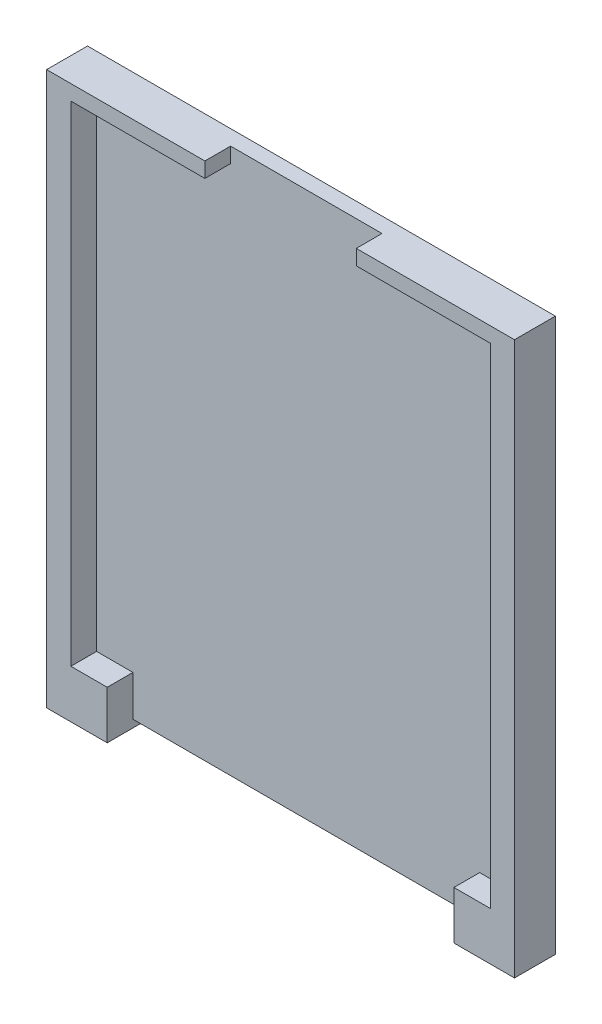
ISO-10303-21;
HEADER;
FILE_DESCRIPTION(('STEP AP214'),'2;1');
FILE_NAME('part.step','',(''),(''),'','','');
FILE_SCHEMA(('AUTOMOTIVE_DESIGN { 1 0 10303 214 1 1 1 1 }'));
ENDSEC;
DATA;
#1=APPLICATION_CONTEXT('core data for automotive mechanical design processes');
#2=APPLICATION_PROTOCOL_DEFINITION('international standard','automotive_design',2000,#1);
#3=PRODUCT_CONTEXT('',#1,'mechanical');
#4=PRODUCT('Part','Part','',(#3));
#5=PRODUCT_RELATED_PRODUCT_CATEGORY('part','',(#4));
#6=PRODUCT_DEFINITION_FORMATION('','',#4);
#7=PRODUCT_DEFINITION_CONTEXT('part definition',#1,'design');
#8=PRODUCT_DEFINITION('design','',#6,#7);
#9=PRODUCT_DEFINITION_SHAPE('','',#8);
#10=(LENGTH_UNIT() NAMED_UNIT(*) SI_UNIT(.MILLI.,.METRE.));
#11=(NAMED_UNIT(*) PLANE_ANGLE_UNIT() SI_UNIT($,.RADIAN.));
#12=(NAMED_UNIT(*) SI_UNIT($,.STERADIAN.) SOLID_ANGLE_UNIT());
#13=UNCERTAINTY_MEASURE_WITH_UNIT(LENGTH_MEASURE(1.E-05),#10,'distance_accuracy_value','');
#14=(GEOMETRIC_REPRESENTATION_CONTEXT(3) GLOBAL_UNCERTAINTY_ASSIGNED_CONTEXT((#13)) GLOBAL_UNIT_ASSIGNED_CONTEXT((#10,
#11,#12)) REPRESENTATION_CONTEXT('',''));
#15=CARTESIAN_POINT('',(0.,0.,0.));
#16=DIRECTION('',(0.,0.,1.));
#17=DIRECTION('',(1.,0.,0.));
#18=AXIS2_PLACEMENT_3D('',#15,#16,#17);
#19=CARTESIAN_POINT('',(-14.58,-15.82,1.));
#20=DIRECTION('',(0.,-1.,0.));
#21=DIRECTION('',(0.,0.,-1.));
#22=AXIS2_PLACEMENT_3D('',#19,#20,#21);
#23=PLANE('',#22);
#24=DIRECTION('',(0.,0.,1.));
#25=VECTOR('',#24,1.);
#26=CARTESIAN_POINT('',(-12.18,-15.82,1.));
#27=LINE('',#26,#25);
#28=CARTESIAN_POINT('',(-12.18,-15.82,2.7));
#29=VERTEX_POINT('',#28);
#30=CARTESIAN_POINT('',(-12.18,-15.82,1.));
#31=VERTEX_POINT('',#30);
#32=EDGE_CURVE('E229',#29,#31,#27,.F.);
#33=ORIENTED_EDGE('',*,*,#32,.T.);
#34=DIRECTION('',(-1.,0.,0.));
#35=VECTOR('',#34,1.);
#36=CARTESIAN_POINT('',(4.27,-15.82,1.));
#37=LINE('',#36,#35);
#38=CARTESIAN_POINT('',(-14.58,-15.82,1.));
#39=VERTEX_POINT('',#38);
#40=EDGE_CURVE('E153',#31,#39,#37,.T.);
#41=ORIENTED_EDGE('',*,*,#40,.T.);
#42=DIRECTION('',(0.,0.,1.));
#43=VECTOR('',#42,1.);
#44=CARTESIAN_POINT('',(-14.58,-15.82,1.));
#45=LINE('',#44,#43);
#46=CARTESIAN_POINT('',(-14.58,-15.82,2.7));
#47=VERTEX_POINT('',#46);
#48=EDGE_CURVE('E20',#39,#47,#45,.T.);
#49=ORIENTED_EDGE('',*,*,#48,.T.);
#50=DIRECTION('',(1.,0.,0.));
#51=VECTOR('',#50,1.);
#52=CARTESIAN_POINT('',(-16.18,-15.82,2.7));
#53=LINE('',#52,#51);
#54=EDGE_CURVE('E143',#29,#47,#53,.F.);
#55=ORIENTED_EDGE('',*,*,#54,.F.);
#56=EDGE_LOOP('',(#33,#41,#49,#55));
#57=FACE_BOUND('',#56,.T.);
#58=ADVANCED_FACE('F17',(#57),#23,.F.);
#59=CARTESIAN_POINT('',(-14.58,16.51,1.));
#60=DIRECTION('',(-1.,0.,0.));
#61=DIRECTION('',(0.,-1.,0.));
#62=AXIS2_PLACEMENT_3D('',#59,#60,#61);
#63=PLANE('',#62);
#64=ORIENTED_EDGE('',*,*,#48,.F.);
#65=DIRECTION('',(0.,1.,0.));
#66=VECTOR('',#65,1.);
#67=CARTESIAN_POINT('',(-14.58,17.51,1.));
#68=LINE('',#67,#66);
#69=CARTESIAN_POINT('',(-14.58,16.51,1.));
#70=VERTEX_POINT('',#69);
#71=EDGE_CURVE('E220',#39,#70,#68,.T.);
#72=ORIENTED_EDGE('',*,*,#71,.T.);
#73=DIRECTION('',(0.,0.,1.));
#74=VECTOR('',#73,1.);
#75=CARTESIAN_POINT('',(-14.58,16.51,1.));
#76=LINE('',#75,#74);
#77=CARTESIAN_POINT('',(-14.58,16.51,2.7));
#78=VERTEX_POINT('',#77);
#79=EDGE_CURVE('E157',#70,#78,#76,.T.);
#80=ORIENTED_EDGE('',*,*,#79,.T.);
#81=DIRECTION('',(0.,1.,0.));
#82=VECTOR('',#81,1.);
#83=CARTESIAN_POINT('',(-14.58,-19.,2.7));
#84=LINE('',#83,#82);
#85=EDGE_CURVE('E139',#47,#78,#84,.T.);
#86=ORIENTED_EDGE('',*,*,#85,.F.);
#87=EDGE_LOOP('',(#64,#72,#80,#86));
#88=FACE_BOUND('',#87,.T.);
#89=ADVANCED_FACE('F158',(#88),#63,.F.);
#90=CARTESIAN_POINT('',(-5.73,16.51,1.));
#91=DIRECTION('',(0.,1.,0.));
#92=DIRECTION('',(0.,0.,1.));
#93=AXIS2_PLACEMENT_3D('',#90,#91,#92);
#94=PLANE('',#93);
#95=ORIENTED_EDGE('',*,*,#79,.F.);
#96=DIRECTION('',(-1.,0.,0.));
#97=VECTOR('',#96,1.);
#98=CARTESIAN_POINT('',(4.27,16.51,1.));
#99=LINE('',#98,#97);
#100=CARTESIAN_POINT('',(-5.73,16.51,1.));
#101=VERTEX_POINT('',#100);
#102=EDGE_CURVE('E217',#70,#101,#99,.F.);
#103=ORIENTED_EDGE('',*,*,#102,.T.);
#104=DIRECTION('',(0.,0.,1.));
#105=VECTOR('',#104,1.);
#106=CARTESIAN_POINT('',(-5.73,16.51,1.));
#107=LINE('',#106,#105);
#108=CARTESIAN_POINT('',(-5.73000000000001,16.51,2.7));
#109=VERTEX_POINT('',#108);
#110=EDGE_CURVE('E167',#101,#109,#107,.T.);
#111=ORIENTED_EDGE('',*,*,#110,.T.);
#112=DIRECTION('',(1.,0.,0.));
#113=VECTOR('',#112,1.);
#114=CARTESIAN_POINT('',(-16.18,16.51,2.7));
#115=LINE('',#114,#113);
#116=EDGE_CURVE('E160',#78,#109,#115,.T.);
#117=ORIENTED_EDGE('',*,*,#116,.F.);
#118=EDGE_LOOP('',(#95,#103,#111,#117));
#119=FACE_BOUND('',#118,.T.);
#120=ADVANCED_FACE('F334',(#119),#94,.F.);
#121=CARTESIAN_POINT('',(4.27,16.51,1.));
#122=DIRECTION('',(0.,1.,0.));
#123=DIRECTION('',(0.,0.,1.));
#124=AXIS2_PLACEMENT_3D('',#121,#122,#123);
#125=PLANE('',#124);
#126=DIRECTION('',(0.,0.,-1.));
#127=VECTOR('',#126,1.);
#128=CARTESIAN_POINT('',(4.27,16.51,1.));
#129=LINE('',#128,#127);
#130=CARTESIAN_POINT('',(4.27,16.51,2.7));
#131=VERTEX_POINT('',#130);
#132=CARTESIAN_POINT('',(4.27,16.51,1.));
#133=VERTEX_POINT('',#132);
#134=EDGE_CURVE('E150',#131,#133,#129,.T.);
#135=ORIENTED_EDGE('',*,*,#134,.T.);
#136=DIRECTION('',(-1.,0.,0.));
#137=VECTOR('',#136,1.);
#138=CARTESIAN_POINT('',(4.27,16.51,1.));
#139=LINE('',#138,#137);
#140=CARTESIAN_POINT('',(13.12,16.51,1.));
#141=VERTEX_POINT('',#140);
#142=EDGE_CURVE('E184',#133,#141,#139,.F.);
#143=ORIENTED_EDGE('',*,*,#142,.T.);
#144=DIRECTION('',(0.,0.,1.));
#145=VECTOR('',#144,1.);
#146=CARTESIAN_POINT('',(13.12,16.51,1.));
#147=LINE('',#146,#145);
#148=CARTESIAN_POINT('',(13.12,16.51,2.7));
#149=VERTEX_POINT('',#148);
#150=EDGE_CURVE('E175',#141,#149,#147,.T.);
#151=ORIENTED_EDGE('',*,*,#150,.T.);
#152=DIRECTION('',(1.,0.,0.));
#153=VECTOR('',#152,1.);
#154=CARTESIAN_POINT('',(-16.18,16.51,2.7));
#155=LINE('',#154,#153);
#156=EDGE_CURVE('E182',#131,#149,#155,.T.);
#157=ORIENTED_EDGE('',*,*,#156,.F.);
#158=EDGE_LOOP('',(#135,#143,#151,#157));
#159=FACE_BOUND('',#158,.T.);
#160=ADVANCED_FACE('F181',(#159),#125,.F.);
#161=CARTESIAN_POINT('',(13.12,16.51,1.));
#162=DIRECTION('',(1.,0.,0.));
#163=DIRECTION('',(0.,1.,0.));
#164=AXIS2_PLACEMENT_3D('',#161,#162,#163);
#165=PLANE('',#164);
#166=ORIENTED_EDGE('',*,*,#150,.F.);
#167=DIRECTION('',(0.,1.,0.));
#168=VECTOR('',#167,1.);
#169=CARTESIAN_POINT('',(13.12,17.51,1.));
#170=LINE('',#169,#168);
#171=CARTESIAN_POINT('',(13.12,-15.82,1.));
#172=VERTEX_POINT('',#171);
#173=EDGE_CURVE('E208',#141,#172,#170,.F.);
#174=ORIENTED_EDGE('',*,*,#173,.T.);
#175=DIRECTION('',(0.,0.,-1.));
#176=VECTOR('',#175,1.);
#177=CARTESIAN_POINT('',(13.12,-15.82,1.));
#178=LINE('',#177,#176);
#179=CARTESIAN_POINT('',(13.12,-15.82,2.7));
#180=VERTEX_POINT('',#179);
#181=EDGE_CURVE('E170',#172,#180,#178,.F.);
#182=ORIENTED_EDGE('',*,*,#181,.T.);
#183=DIRECTION('',(0.,1.,0.));
#184=VECTOR('',#183,1.);
#185=CARTESIAN_POINT('',(13.12,-19.,2.7));
#186=LINE('',#185,#184);
#187=EDGE_CURVE('E188',#149,#180,#186,.F.);
#188=ORIENTED_EDGE('',*,*,#187,.F.);
#189=EDGE_LOOP('',(#166,#174,#182,#188));
#190=FACE_BOUND('',#189,.T.);
#191=ADVANCED_FACE('F189',(#190),#165,.F.);
#192=CARTESIAN_POINT('',(13.12,-15.82,1.));
#193=DIRECTION('',(0.,-1.,0.));
#194=DIRECTION('',(0.,0.,-1.));
#195=AXIS2_PLACEMENT_3D('',#192,#193,#194);
#196=PLANE('',#195);
#197=ORIENTED_EDGE('',*,*,#181,.F.);
#198=DIRECTION('',(-1.,0.,0.));
#199=VECTOR('',#198,1.);
#200=CARTESIAN_POINT('',(4.27,-15.82,1.));
#201=LINE('',#200,#199);
#202=CARTESIAN_POINT('',(10.72,-15.82,1.));
#203=VERTEX_POINT('',#202);
#204=EDGE_CURVE('E205',#172,#203,#201,.T.);
#205=ORIENTED_EDGE('',*,*,#204,.T.);
#206=DIRECTION('',(0.,0.,-1.));
#207=VECTOR('',#206,1.);
#208=CARTESIAN_POINT('',(10.72,-15.82,1.));
#209=LINE('',#208,#207);
#210=CARTESIAN_POINT('',(10.72,-15.82,2.7));
#211=VERTEX_POINT('',#210);
#212=EDGE_CURVE('E173',#211,#203,#209,.T.);
#213=ORIENTED_EDGE('',*,*,#212,.F.);
#214=DIRECTION('',(1.,0.,0.));
#215=VECTOR('',#214,1.);
#216=CARTESIAN_POINT('',(-16.18,-15.82,2.7));
#217=LINE('',#216,#215);
#218=EDGE_CURVE('E193',#180,#211,#217,.F.);
#219=ORIENTED_EDGE('',*,*,#218,.F.);
#220=EDGE_LOOP('',(#197,#205,#213,#219));
#221=FACE_BOUND('',#220,.T.);
#222=ADVANCED_FACE('F379',(#221),#196,.F.);
#223=CARTESIAN_POINT('',(-5.73,17.51,1.));
#224=DIRECTION('',(-1.,0.,0.));
#225=DIRECTION('',(0.,0.,1.));
#226=AXIS2_PLACEMENT_3D('',#223,#224,#225);
#227=PLANE('',#226);
#228=ORIENTED_EDGE('',*,*,#110,.F.);
#229=DIRECTION('',(0.,1.,0.));
#230=VECTOR('',#229,1.);
#231=CARTESIAN_POINT('',(-5.73,17.51,1.));
#232=LINE('',#231,#230);
#233=CARTESIAN_POINT('',(-5.73000000000001,17.51,1.));
#234=VERTEX_POINT('',#233);
#235=EDGE_CURVE('E214',#101,#234,#232,.T.);
#236=ORIENTED_EDGE('',*,*,#235,.T.);
#237=DIRECTION('',(0.,0.,-1.));
#238=VECTOR('',#237,1.);
#239=CARTESIAN_POINT('',(-5.73000000000001,17.51,2.7));
#240=LINE('',#239,#238);
#241=CARTESIAN_POINT('',(-5.73000000000001,17.51,2.7));
#242=VERTEX_POINT('',#241);
#243=EDGE_CURVE('E241',#234,#242,#240,.F.);
#244=ORIENTED_EDGE('',*,*,#243,.T.);
#245=DIRECTION('',(0.,1.,0.));
#246=VECTOR('',#245,1.);
#247=CARTESIAN_POINT('',(-5.73000000000001,-19.,2.7));
#248=LINE('',#247,#246);
#249=EDGE_CURVE('E162',#109,#242,#248,.T.);
#250=ORIENTED_EDGE('',*,*,#249,.F.);
#251=EDGE_LOOP('',(#228,#236,#244,#250));
#252=FACE_BOUND('',#251,.T.);
#253=ADVANCED_FACE('F246',(#252),#227,.F.);
#254=CARTESIAN_POINT('',(4.27,17.51,1.));
#255=DIRECTION('',(1.,0.,0.));
#256=DIRECTION('',(0.,0.,-1.));
#257=AXIS2_PLACEMENT_3D('',#254,#255,#256);
#258=PLANE('',#257);
#259=DIRECTION('',(0.,0.,-1.));
#260=VECTOR('',#259,1.);
#261=CARTESIAN_POINT('',(4.27,17.51,2.7));
#262=LINE('',#261,#260);
#263=CARTESIAN_POINT('',(4.27,17.51,2.7));
#264=VERTEX_POINT('',#263);
#265=CARTESIAN_POINT('',(4.27,17.51,1.));
#266=VERTEX_POINT('',#265);
#267=EDGE_CURVE('E308',#264,#266,#262,.T.);
#268=ORIENTED_EDGE('',*,*,#267,.T.);
#269=DIRECTION('',(0.,1.,0.));
#270=VECTOR('',#269,1.);
#271=CARTESIAN_POINT('',(4.27,17.51,1.));
#272=LINE('',#271,#270);
#273=EDGE_CURVE('E211',#266,#133,#272,.F.);
#274=ORIENTED_EDGE('',*,*,#273,.T.);
#275=ORIENTED_EDGE('',*,*,#134,.F.);
#276=DIRECTION('',(0.,1.,0.));
#277=VECTOR('',#276,1.);
#278=CARTESIAN_POINT('',(4.27,-19.,2.7));
#279=LINE('',#278,#277);
#280=EDGE_CURVE('E196',#264,#131,#279,.F.);
#281=ORIENTED_EDGE('',*,*,#280,.F.);
#282=EDGE_LOOP('',(#268,#274,#275,#281));
#283=FACE_BOUND('',#282,.T.);
#284=ADVANCED_FACE('F373',(#283),#258,.F.);
#285=CARTESIAN_POINT('',(-16.18,-19.,2.7));
#286=DIRECTION('',(0.,0.,1.));
#287=DIRECTION('',(1.,0.,0.));
#288=AXIS2_PLACEMENT_3D('',#285,#286,#287);
#289=PLANE('',#288);
#290=DIRECTION('',(0.,1.,0.));
#291=VECTOR('',#290,1.);
#292=CARTESIAN_POINT('',(-16.18,17.51,2.7));
#293=LINE('',#292,#291);
#294=CARTESIAN_POINT('',(-16.18,17.51,2.7));
#295=VERTEX_POINT('',#294);
#296=CARTESIAN_POINT('',(-16.18,-19.,2.7));
#297=VERTEX_POINT('',#296);
#298=EDGE_CURVE('E303',#295,#297,#293,.F.);
#299=ORIENTED_EDGE('',*,*,#298,.T.);
#300=DIRECTION('',(1.,0.,0.));
#301=VECTOR('',#300,1.);
#302=CARTESIAN_POINT('',(-16.18,-19.,2.7));
#303=LINE('',#302,#301);
#304=CARTESIAN_POINT('',(-12.18,-19.,2.7));
#305=VERTEX_POINT('',#304);
#306=EDGE_CURVE('E298',#297,#305,#303,.T.);
#307=ORIENTED_EDGE('',*,*,#306,.T.);
#308=DIRECTION('',(0.,-1.,0.));
#309=VECTOR('',#308,1.);
#310=CARTESIAN_POINT('',(-12.18,-15.82,2.7));
#311=LINE('',#310,#309);
#312=EDGE_CURVE('E147',#305,#29,#311,.F.);
#313=ORIENTED_EDGE('',*,*,#312,.T.);
#314=ORIENTED_EDGE('',*,*,#54,.T.);
#315=ORIENTED_EDGE('',*,*,#85,.T.);
#316=ORIENTED_EDGE('',*,*,#116,.T.);
#317=ORIENTED_EDGE('',*,*,#249,.T.);
#318=DIRECTION('',(1.,0.,0.));
#319=VECTOR('',#318,1.);
#320=CARTESIAN_POINT('',(-16.18,17.51,2.7));
#321=LINE('',#320,#319);
#322=EDGE_CURVE('E232',#242,#295,#321,.F.);
#323=ORIENTED_EDGE('',*,*,#322,.T.);
#324=EDGE_LOOP('',(#299,#307,#313,#314,#315,#316,#317,#323));
#325=FACE_BOUND('',#324,.T.);
#326=ADVANCED_FACE('F145',(#325),#289,.T.);
#327=CARTESIAN_POINT('',(-12.18,-15.82,1.));
#328=DIRECTION('',(-1.,0.,0.));
#329=DIRECTION('',(0.,-1.,0.));
#330=AXIS2_PLACEMENT_3D('',#327,#328,#329);
#331=PLANE('',#330);
#332=DIRECTION('',(0.,0.,1.));
#333=VECTOR('',#332,1.);
#334=CARTESIAN_POINT('',(-12.18,-19.,2.7));
#335=LINE('',#334,#333);
#336=CARTESIAN_POINT('',(-12.18,-19.,0.));
#337=VERTEX_POINT('',#336);
#338=EDGE_CURVE('E295',#305,#337,#335,.F.);
#339=ORIENTED_EDGE('',*,*,#338,.T.);
#340=DIRECTION('',(0.,-1.,0.));
#341=VECTOR('',#340,1.);
#342=CARTESIAN_POINT('',(-12.18,-15.82,0.));
#343=LINE('',#342,#341);
#344=CARTESIAN_POINT('',(-12.18,-18.5,0.));
#345=VERTEX_POINT('',#344);
#346=EDGE_CURVE('E224',#345,#337,#343,.T.);
#347=ORIENTED_EDGE('',*,*,#346,.F.);
#348=DIRECTION('',(0.,0.,1.));
#349=VECTOR('',#348,1.);
#350=CARTESIAN_POINT('',(-12.18,-18.5,1.));
#351=LINE('',#350,#349);
#352=CARTESIAN_POINT('',(-12.18,-18.5,1.));
#353=VERTEX_POINT('',#352);
#354=EDGE_CURVE('E226',#353,#345,#351,.F.);
#355=ORIENTED_EDGE('',*,*,#354,.F.);
#356=DIRECTION('',(0.,1.,0.));
#357=VECTOR('',#356,1.);
#358=CARTESIAN_POINT('',(-12.18,17.51,1.));
#359=LINE('',#358,#357);
#360=EDGE_CURVE('E202',#353,#31,#359,.T.);
#361=ORIENTED_EDGE('',*,*,#360,.T.);
#362=ORIENTED_EDGE('',*,*,#32,.F.);
#363=ORIENTED_EDGE('',*,*,#312,.F.);
#364=EDGE_LOOP('',(#339,#347,#355,#361,#362,#363));
#365=FACE_BOUND('',#364,.T.);
#366=ADVANCED_FACE('F328',(#365),#331,.F.);
#367=CARTESIAN_POINT('',(4.27,17.51,1.));
#368=DIRECTION('',(0.,0.,-1.));
#369=DIRECTION('',(-1.,0.,0.));
#370=AXIS2_PLACEMENT_3D('',#367,#368,#369);
#371=PLANE('',#370);
#372=DIRECTION('',(-1.,0.,0.));
#373=VECTOR('',#372,1.);
#374=CARTESIAN_POINT('',(10.72,-18.5,1.));
#375=LINE('',#374,#373);
#376=CARTESIAN_POINT('',(10.72,-18.5,1.));
#377=VERTEX_POINT('',#376);
#378=EDGE_CURVE('E271',#353,#377,#375,.F.);
#379=ORIENTED_EDGE('',*,*,#378,.T.);
#380=DIRECTION('',(0.,1.,0.));
#381=VECTOR('',#380,1.);
#382=CARTESIAN_POINT('',(10.72,-15.82,1.));
#383=LINE('',#382,#381);
#384=EDGE_CURVE('E257',#377,#203,#383,.T.);
#385=ORIENTED_EDGE('',*,*,#384,.T.);
#386=ORIENTED_EDGE('',*,*,#204,.F.);
#387=ORIENTED_EDGE('',*,*,#173,.F.);
#388=ORIENTED_EDGE('',*,*,#142,.F.);
#389=ORIENTED_EDGE('',*,*,#273,.F.);
#390=DIRECTION('',(1.,0.,0.));
#391=VECTOR('',#390,1.);
#392=CARTESIAN_POINT('',(-16.18,17.51,1.));
#393=LINE('',#392,#391);
#394=EDGE_CURVE('E306',#266,#234,#393,.F.);
#395=ORIENTED_EDGE('',*,*,#394,.T.);
#396=ORIENTED_EDGE('',*,*,#235,.F.);
#397=ORIENTED_EDGE('',*,*,#102,.F.);
#398=ORIENTED_EDGE('',*,*,#71,.F.);
#399=ORIENTED_EDGE('',*,*,#40,.F.);
#400=ORIENTED_EDGE('',*,*,#360,.F.);
#401=EDGE_LOOP('',(#379,#385,#386,#387,#388,#389,#395,#396,#397,#398,#399,#400));
#402=FACE_BOUND('',#401,.T.);
#403=ADVANCED_FACE('F331',(#402),#371,.F.);
#404=CARTESIAN_POINT('',(-16.18,-19.,2.7));
#405=DIRECTION('',(0.,0.,1.));
#406=DIRECTION('',(1.,0.,0.));
#407=AXIS2_PLACEMENT_3D('',#404,#405,#406);
#408=PLANE('',#407);
#409=DIRECTION('',(0.,-1.,0.));
#410=VECTOR('',#409,1.);
#411=CARTESIAN_POINT('',(14.72,17.51,2.7));
#412=LINE('',#411,#410);
#413=CARTESIAN_POINT('',(14.72,-19.,2.7));
#414=VERTEX_POINT('',#413);
#415=CARTESIAN_POINT('',(14.72,17.51,2.7));
#416=VERTEX_POINT('',#415);
#417=EDGE_CURVE('E249',#414,#416,#412,.F.);
#418=ORIENTED_EDGE('',*,*,#417,.T.);
#419=DIRECTION('',(1.,0.,0.));
#420=VECTOR('',#419,1.);
#421=CARTESIAN_POINT('',(-16.18,17.51,2.7));
#422=LINE('',#421,#420);
#423=EDGE_CURVE('E311',#416,#264,#422,.F.);
#424=ORIENTED_EDGE('',*,*,#423,.T.);
#425=ORIENTED_EDGE('',*,*,#280,.T.);
#426=ORIENTED_EDGE('',*,*,#156,.T.);
#427=ORIENTED_EDGE('',*,*,#187,.T.);
#428=ORIENTED_EDGE('',*,*,#218,.T.);
#429=DIRECTION('',(0.,1.,0.));
#430=VECTOR('',#429,1.);
#431=CARTESIAN_POINT('',(10.72,-15.82,2.7));
#432=LINE('',#431,#430);
#433=CARTESIAN_POINT('',(10.72,-19.,2.7));
#434=VERTEX_POINT('',#433);
#435=EDGE_CURVE('E251',#211,#434,#432,.F.);
#436=ORIENTED_EDGE('',*,*,#435,.T.);
#437=DIRECTION('',(1.,0.,0.));
#438=VECTOR('',#437,1.);
#439=CARTESIAN_POINT('',(-16.18,-19.,2.7));
#440=LINE('',#439,#438);
#441=EDGE_CURVE('E270',#434,#414,#440,.T.);
#442=ORIENTED_EDGE('',*,*,#441,.T.);
#443=EDGE_LOOP('',(#418,#424,#425,#426,#427,#428,#436,#442));
#444=FACE_BOUND('',#443,.T.);
#445=ADVANCED_FACE('F364',(#444),#408,.T.);
#446=CARTESIAN_POINT('',(10.72,-15.82,1.));
#447=DIRECTION('',(1.,0.,0.));
#448=DIRECTION('',(0.,1.,0.));
#449=AXIS2_PLACEMENT_3D('',#446,#447,#448);
#450=PLANE('',#449);
#451=ORIENTED_EDGE('',*,*,#212,.T.);
#452=ORIENTED_EDGE('',*,*,#384,.F.);
#453=DIRECTION('',(0.,0.,1.));
#454=VECTOR('',#453,1.);
#455=CARTESIAN_POINT('',(10.72,-18.5,-0.7));
#456=LINE('',#455,#454);
#457=CARTESIAN_POINT('',(10.72,-18.5,0.));
#458=VERTEX_POINT('',#457);
#459=EDGE_CURVE('E265',#377,#458,#456,.F.);
#460=ORIENTED_EDGE('',*,*,#459,.T.);
#461=DIRECTION('',(0.,1.,0.));
#462=VECTOR('',#461,1.);
#463=CARTESIAN_POINT('',(10.72,-15.82,0.));
#464=LINE('',#463,#462);
#465=CARTESIAN_POINT('',(10.72,-19.,0.));
#466=VERTEX_POINT('',#465);
#467=EDGE_CURVE('E35',#466,#458,#464,.T.);
#468=ORIENTED_EDGE('',*,*,#467,.F.);
#469=DIRECTION('',(0.,0.,1.));
#470=VECTOR('',#469,1.);
#471=CARTESIAN_POINT('',(10.72,-19.,2.7));
#472=LINE('',#471,#470);
#473=EDGE_CURVE('E287',#466,#434,#472,.T.);
#474=ORIENTED_EDGE('',*,*,#473,.T.);
#475=ORIENTED_EDGE('',*,*,#435,.F.);
#476=EDGE_LOOP('',(#451,#452,#460,#468,#474,#475));
#477=FACE_BOUND('',#476,.T.);
#478=ADVANCED_FACE('F266',(#477),#450,.F.);
#479=CARTESIAN_POINT('',(14.72,17.51,2.7));
#480=DIRECTION('',(-1.,0.,0.));
#481=DIRECTION('',(0.,-1.,0.));
#482=AXIS2_PLACEMENT_3D('',#479,#480,#481);
#483=PLANE('',#482);
#484=DIRECTION('',(0.,0.,-1.));
#485=VECTOR('',#484,1.);
#486=CARTESIAN_POINT('',(14.72,17.51,2.7));
#487=LINE('',#486,#485);
#488=CARTESIAN_POINT('',(14.72,17.51,0.));
#489=VERTEX_POINT('',#488);
#490=EDGE_CURVE('E244',#489,#416,#487,.F.);
#491=ORIENTED_EDGE('',*,*,#490,.T.);
#492=ORIENTED_EDGE('',*,*,#417,.F.);
#493=DIRECTION('',(0.,0.,1.));
#494=VECTOR('',#493,1.);
#495=CARTESIAN_POINT('',(14.72,-19.,2.7));
#496=LINE('',#495,#494);
#497=CARTESIAN_POINT('',(14.72,-19.,0.));
#498=VERTEX_POINT('',#497);
#499=EDGE_CURVE('E289',#414,#498,#496,.F.);
#500=ORIENTED_EDGE('',*,*,#499,.T.);
#501=DIRECTION('',(0.,1.,0.));
#502=VECTOR('',#501,1.);
#503=CARTESIAN_POINT('',(14.72,-19.,0.));
#504=LINE('',#503,#502);
#505=EDGE_CURVE('E284',#498,#489,#504,.T.);
#506=ORIENTED_EDGE('',*,*,#505,.T.);
#507=EDGE_LOOP('',(#491,#492,#500,#506));
#508=FACE_BOUND('',#507,.T.);
#509=ADVANCED_FACE('F315',(#508),#483,.F.);
#510=CARTESIAN_POINT('',(-16.18,17.51,2.7));
#511=DIRECTION('',(0.,-1.,0.));
#512=DIRECTION('',(0.,0.,-1.));
#513=AXIS2_PLACEMENT_3D('',#510,#511,#512);
#514=PLANE('',#513);
#515=ORIENTED_EDGE('',*,*,#267,.F.);
#516=ORIENTED_EDGE('',*,*,#423,.F.);
#517=ORIENTED_EDGE('',*,*,#490,.F.);
#518=DIRECTION('',(1.,0.,0.));
#519=VECTOR('',#518,1.);
#520=CARTESIAN_POINT('',(-16.18,17.51,0.));
#521=LINE('',#520,#519);
#522=CARTESIAN_POINT('',(-16.18,17.51,0.));
#523=VERTEX_POINT('',#522);
#524=EDGE_CURVE('E282',#489,#523,#521,.F.);
#525=ORIENTED_EDGE('',*,*,#524,.T.);
#526=DIRECTION('',(0.,0.,1.));
#527=VECTOR('',#526,1.);
#528=CARTESIAN_POINT('',(-16.18,17.51,2.7));
#529=LINE('',#528,#527);
#530=EDGE_CURVE('E243',#523,#295,#529,.T.);
#531=ORIENTED_EDGE('',*,*,#530,.T.);
#532=ORIENTED_EDGE('',*,*,#322,.F.);
#533=ORIENTED_EDGE('',*,*,#243,.F.);
#534=ORIENTED_EDGE('',*,*,#394,.F.);
#535=EDGE_LOOP('',(#515,#516,#517,#525,#531,#532,#533,#534));
#536=FACE_BOUND('',#535,.T.);
#537=ADVANCED_FACE('F239',(#536),#514,.F.);
#538=CARTESIAN_POINT('',(-16.18,17.51,2.7));
#539=DIRECTION('',(1.,0.,0.));
#540=DIRECTION('',(0.,1.,0.));
#541=AXIS2_PLACEMENT_3D('',#538,#539,#540);
#542=PLANE('',#541);
#543=DIRECTION('',(0.,0.,1.));
#544=VECTOR('',#543,1.);
#545=CARTESIAN_POINT('',(-16.18,-19.,2.7));
#546=LINE('',#545,#544);
#547=CARTESIAN_POINT('',(-16.18,-19.,0.));
#548=VERTEX_POINT('',#547);
#549=EDGE_CURVE('E300',#548,#297,#546,.T.);
#550=ORIENTED_EDGE('',*,*,#549,.T.);
#551=ORIENTED_EDGE('',*,*,#298,.F.);
#552=ORIENTED_EDGE('',*,*,#530,.F.);
#553=DIRECTION('',(0.,1.,0.));
#554=VECTOR('',#553,1.);
#555=CARTESIAN_POINT('',(-16.18,-19.,0.));
#556=LINE('',#555,#554);
#557=EDGE_CURVE('E277',#523,#548,#556,.F.);
#558=ORIENTED_EDGE('',*,*,#557,.T.);
#559=EDGE_LOOP('',(#550,#551,#552,#558));
#560=FACE_BOUND('',#559,.T.);
#561=ADVANCED_FACE('F322',(#560),#542,.F.);
#562=CARTESIAN_POINT('',(-16.18,-19.,2.7));
#563=DIRECTION('',(0.,1.,0.));
#564=DIRECTION('',(0.,0.,1.));
#565=AXIS2_PLACEMENT_3D('',#562,#563,#564);
#566=PLANE('',#565);
#567=ORIENTED_EDGE('',*,*,#338,.F.);
#568=ORIENTED_EDGE('',*,*,#306,.F.);
#569=ORIENTED_EDGE('',*,*,#549,.F.);
#570=DIRECTION('',(1.,0.,0.));
#571=VECTOR('',#570,1.);
#572=CARTESIAN_POINT('',(-16.18,-19.,0.));
#573=LINE('',#572,#571);
#574=EDGE_CURVE('E274',#548,#337,#573,.T.);
#575=ORIENTED_EDGE('',*,*,#574,.T.);
#576=EDGE_LOOP('',(#567,#568,#569,#575));
#577=FACE_BOUND('',#576,.T.);
#578=ADVANCED_FACE('F326',(#577),#566,.F.);
#579=CARTESIAN_POINT('',(10.72,-18.5,-0.7));
#580=DIRECTION('',(0.,1.,0.));
#581=DIRECTION('',(-1.,0.,0.));
#582=AXIS2_PLACEMENT_3D('',#579,#580,#581);
#583=PLANE('',#582);
#584=ORIENTED_EDGE('',*,*,#378,.F.);
#585=ORIENTED_EDGE('',*,*,#354,.T.);
#586=DIRECTION('',(1.,0.,0.));
#587=VECTOR('',#586,1.);
#588=CARTESIAN_POINT('',(-16.18,-18.5,0.));
#589=LINE('',#588,#587);
#590=EDGE_CURVE('E26',#345,#458,#589,.T.);
#591=ORIENTED_EDGE('',*,*,#590,.T.);
#592=ORIENTED_EDGE('',*,*,#459,.F.);
#593=EDGE_LOOP('',(#584,#585,#591,#592));
#594=FACE_BOUND('',#593,.T.);
#595=ADVANCED_FACE('F273',(#594),#583,.F.);
#596=CARTESIAN_POINT('',(-16.18,-19.,2.7));
#597=DIRECTION('',(0.,1.,0.));
#598=DIRECTION('',(0.,0.,1.));
#599=AXIS2_PLACEMENT_3D('',#596,#597,#598);
#600=PLANE('',#599);
#601=DIRECTION('',(1.,0.,0.));
#602=VECTOR('',#601,1.);
#603=CARTESIAN_POINT('',(-16.18,-19.,0.));
#604=LINE('',#603,#602);
#605=EDGE_CURVE('E11',#466,#498,#604,.T.);
#606=ORIENTED_EDGE('',*,*,#605,.T.);
#607=ORIENTED_EDGE('',*,*,#499,.F.);
#608=ORIENTED_EDGE('',*,*,#441,.F.);
#609=ORIENTED_EDGE('',*,*,#473,.F.);
#610=EDGE_LOOP('',(#606,#607,#608,#609));
#611=FACE_BOUND('',#610,.T.);
#612=ADVANCED_FACE('F344',(#611),#600,.F.);
#613=CARTESIAN_POINT('',(-16.18,-19.,0.));
#614=DIRECTION('',(0.,0.,1.));
#615=DIRECTION('',(1.,0.,0.));
#616=AXIS2_PLACEMENT_3D('',#613,#614,#615);
#617=PLANE('',#616);
#618=ORIENTED_EDGE('',*,*,#467,.T.);
#619=ORIENTED_EDGE('',*,*,#590,.F.);
#620=ORIENTED_EDGE('',*,*,#346,.T.);
#621=ORIENTED_EDGE('',*,*,#574,.F.);
#622=ORIENTED_EDGE('',*,*,#557,.F.);
#623=ORIENTED_EDGE('',*,*,#524,.F.);
#624=ORIENTED_EDGE('',*,*,#505,.F.);
#625=ORIENTED_EDGE('',*,*,#605,.F.);
#626=EDGE_LOOP('',(#618,#619,#620,#621,#622,#623,#624,#625));
#627=FACE_BOUND('',#626,.T.);
#628=ADVANCED_FACE('F262',(#627),#617,.F.);
#629=CLOSED_SHELL('',(#58,#89,#120,#160,#191,#222,#253,#284,#326,#366,#403,#445,#478,#509,#537,
#561,#578,#595,#612,#628));
#630=MANIFOLD_SOLID_BREP('B1',#629);
#631=ADVANCED_BREP_SHAPE_REPRESENTATION('',(#18,#630),#14);
#632=SHAPE_DEFINITION_REPRESENTATION(#9,#631);
ENDSEC;
END-ISO-10303-21;
